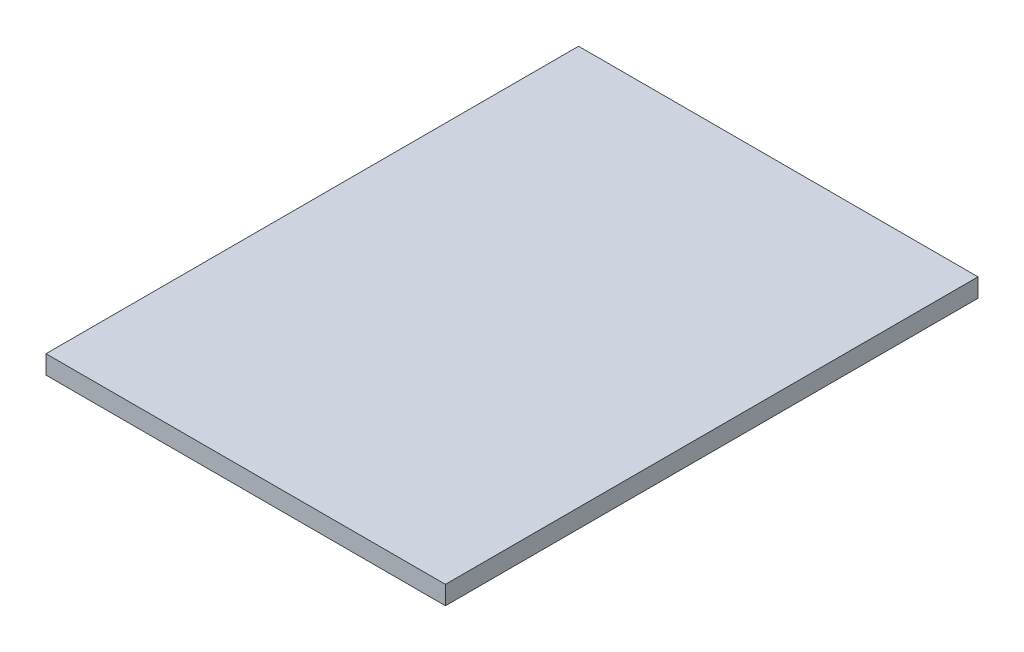
ISO-10303-21;
HEADER;
FILE_DESCRIPTION(('STEP AP214'),'2;1');
FILE_NAME('part.step','',(''),(''),'','','');
FILE_SCHEMA(('AUTOMOTIVE_DESIGN { 1 0 10303 214 1 1 1 1 }'));
ENDSEC;
DATA;
#1=APPLICATION_CONTEXT('core data for automotive mechanical design processes');
#2=APPLICATION_PROTOCOL_DEFINITION('international standard','automotive_design',2000,#1);
#3=PRODUCT_CONTEXT('',#1,'mechanical');
#4=PRODUCT('Part','Part','',(#3));
#5=PRODUCT_RELATED_PRODUCT_CATEGORY('part','',(#4));
#6=PRODUCT_DEFINITION_FORMATION('','',#4);
#7=PRODUCT_DEFINITION_CONTEXT('part definition',#1,'design');
#8=PRODUCT_DEFINITION('design','',#6,#7);
#9=PRODUCT_DEFINITION_SHAPE('','',#8);
#10=(LENGTH_UNIT() NAMED_UNIT(*) SI_UNIT(.MILLI.,.METRE.));
#11=(NAMED_UNIT(*) PLANE_ANGLE_UNIT() SI_UNIT($,.RADIAN.));
#12=(NAMED_UNIT(*) SI_UNIT($,.STERADIAN.) SOLID_ANGLE_UNIT());
#13=UNCERTAINTY_MEASURE_WITH_UNIT(LENGTH_MEASURE(1.E-05),#10,'distance_accuracy_value','');
#14=(GEOMETRIC_REPRESENTATION_CONTEXT(3) GLOBAL_UNCERTAINTY_ASSIGNED_CONTEXT((#13)) GLOBAL_UNIT_ASSIGNED_CONTEXT((#10,
#11,#12)) REPRESENTATION_CONTEXT('',''));
#15=CARTESIAN_POINT('',(0.,0.,0.));
#16=DIRECTION('',(0.,0.,1.));
#17=DIRECTION('',(1.,0.,0.));
#18=AXIS2_PLACEMENT_3D('',#15,#16,#17);
#19=CARTESIAN_POINT('',(32.25,3.,-43.));
#20=DIRECTION('',(-1.,0.,0.));
#21=DIRECTION('',(0.,0.,1.));
#22=AXIS2_PLACEMENT_3D('',#19,#20,#21);
#23=PLANE('',#22);
#24=DIRECTION('',(0.,0.,-1.));
#25=VECTOR('',#24,1.);
#26=CARTESIAN_POINT('',(32.25,0.,-43.));
#27=LINE('',#26,#25);
#28=CARTESIAN_POINT('',(32.25,0.,43.));
#29=VERTEX_POINT('',#28);
#30=CARTESIAN_POINT('',(32.25,0.,-43.));
#31=VERTEX_POINT('',#30);
#32=EDGE_CURVE('E113',#29,#31,#27,.T.);
#33=ORIENTED_EDGE('',*,*,#32,.T.);
#34=DIRECTION('',(0.,-1.,0.));
#35=VECTOR('',#34,1.);
#36=CARTESIAN_POINT('',(32.25,3.,-43.));
#37=LINE('',#36,#35);
#38=CARTESIAN_POINT('',(32.25,3.,-43.));
#39=VERTEX_POINT('',#38);
#40=EDGE_CURVE('E11',#39,#31,#37,.T.);
#41=ORIENTED_EDGE('',*,*,#40,.F.);
#42=DIRECTION('',(0.,0.,-1.));
#43=VECTOR('',#42,1.);
#44=CARTESIAN_POINT('',(32.25,3.,-43.));
#45=LINE('',#44,#43);
#46=CARTESIAN_POINT('',(32.25,3.,43.));
#47=VERTEX_POINT('',#46);
#48=EDGE_CURVE('E97',#47,#39,#45,.T.);
#49=ORIENTED_EDGE('',*,*,#48,.F.);
#50=DIRECTION('',(0.,-1.,0.));
#51=VECTOR('',#50,1.);
#52=CARTESIAN_POINT('',(32.25,3.,43.));
#53=LINE('',#52,#51);
#54=EDGE_CURVE('E109',#47,#29,#53,.T.);
#55=ORIENTED_EDGE('',*,*,#54,.T.);
#56=EDGE_LOOP('',(#33,#41,#49,#55));
#57=FACE_BOUND('',#56,.T.);
#58=ADVANCED_FACE('F45',(#57),#23,.F.);
#59=CARTESIAN_POINT('',(-32.25,3.,-43.));
#60=DIRECTION('',(0.,0.,1.));
#61=DIRECTION('',(1.,0.,0.));
#62=AXIS2_PLACEMENT_3D('',#59,#60,#61);
#63=PLANE('',#62);
#64=DIRECTION('',(-1.,0.,0.));
#65=VECTOR('',#64,1.);
#66=CARTESIAN_POINT('',(-32.25,0.,-43.));
#67=LINE('',#66,#65);
#68=CARTESIAN_POINT('',(-32.25,0.,-43.));
#69=VERTEX_POINT('',#68);
#70=EDGE_CURVE('E102',#31,#69,#67,.T.);
#71=ORIENTED_EDGE('',*,*,#70,.T.);
#72=DIRECTION('',(0.,-1.,0.));
#73=VECTOR('',#72,1.);
#74=CARTESIAN_POINT('',(-32.25,3.,-43.));
#75=LINE('',#74,#73);
#76=CARTESIAN_POINT('',(-32.25,3.,-43.));
#77=VERTEX_POINT('',#76);
#78=EDGE_CURVE('E54',#77,#69,#75,.T.);
#79=ORIENTED_EDGE('',*,*,#78,.F.);
#80=DIRECTION('',(-1.,0.,0.));
#81=VECTOR('',#80,1.);
#82=CARTESIAN_POINT('',(-32.25,3.,-43.));
#83=LINE('',#82,#81);
#84=EDGE_CURVE('E92',#39,#77,#83,.T.);
#85=ORIENTED_EDGE('',*,*,#84,.F.);
#86=ORIENTED_EDGE('',*,*,#40,.T.);
#87=EDGE_LOOP('',(#71,#79,#85,#86));
#88=FACE_BOUND('',#87,.T.);
#89=ADVANCED_FACE('F101',(#88),#63,.F.);
#90=CARTESIAN_POINT('',(-32.25,3.,-43.));
#91=DIRECTION('',(1.,0.,0.));
#92=DIRECTION('',(0.,0.,-1.));
#93=AXIS2_PLACEMENT_3D('',#90,#91,#92);
#94=PLANE('',#93);
#95=DIRECTION('',(0.,0.,1.));
#96=VECTOR('',#95,1.);
#97=CARTESIAN_POINT('',(-32.25,0.,-43.));
#98=LINE('',#97,#96);
#99=CARTESIAN_POINT('',(-32.25,0.,43.));
#100=VERTEX_POINT('',#99);
#101=EDGE_CURVE('E79',#69,#100,#98,.T.);
#102=ORIENTED_EDGE('',*,*,#101,.T.);
#103=DIRECTION('',(0.,-1.,0.));
#104=VECTOR('',#103,1.);
#105=CARTESIAN_POINT('',(-32.25,3.,43.));
#106=LINE('',#105,#104);
#107=CARTESIAN_POINT('',(-32.25,3.,43.));
#108=VERTEX_POINT('',#107);
#109=EDGE_CURVE('E104',#108,#100,#106,.T.);
#110=ORIENTED_EDGE('',*,*,#109,.F.);
#111=DIRECTION('',(0.,0.,1.));
#112=VECTOR('',#111,1.);
#113=CARTESIAN_POINT('',(-32.25,3.,-43.));
#114=LINE('',#113,#112);
#115=EDGE_CURVE('E95',#77,#108,#114,.T.);
#116=ORIENTED_EDGE('',*,*,#115,.F.);
#117=ORIENTED_EDGE('',*,*,#78,.T.);
#118=EDGE_LOOP('',(#102,#110,#116,#117));
#119=FACE_BOUND('',#118,.T.);
#120=ADVANCED_FACE('F105',(#119),#94,.F.);
#121=CARTESIAN_POINT('',(-32.25,3.,43.));
#122=DIRECTION('',(0.,0.,-1.));
#123=DIRECTION('',(-1.,0.,0.));
#124=AXIS2_PLACEMENT_3D('',#121,#122,#123);
#125=PLANE('',#124);
#126=DIRECTION('',(1.,0.,0.));
#127=VECTOR('',#126,1.);
#128=CARTESIAN_POINT('',(-32.25,0.,43.));
#129=LINE('',#128,#127);
#130=EDGE_CURVE('E85',#100,#29,#129,.T.);
#131=ORIENTED_EDGE('',*,*,#130,.T.);
#132=ORIENTED_EDGE('',*,*,#54,.F.);
#133=DIRECTION('',(1.,0.,0.));
#134=VECTOR('',#133,1.);
#135=CARTESIAN_POINT('',(-32.25,3.,43.));
#136=LINE('',#135,#134);
#137=EDGE_CURVE('E62',#108,#47,#136,.T.);
#138=ORIENTED_EDGE('',*,*,#137,.F.);
#139=ORIENTED_EDGE('',*,*,#109,.T.);
#140=EDGE_LOOP('',(#131,#132,#138,#139));
#141=FACE_BOUND('',#140,.T.);
#142=ADVANCED_FACE('F126',(#141),#125,.F.);
#143=CARTESIAN_POINT('',(0.,3.,0.));
#144=DIRECTION('',(0.,1.,0.));
#145=DIRECTION('',(0.,0.,1.));
#146=AXIS2_PLACEMENT_3D('',#143,#144,#145);
#147=PLANE('',#146);
#148=ORIENTED_EDGE('',*,*,#48,.T.);
#149=ORIENTED_EDGE('',*,*,#84,.T.);
#150=ORIENTED_EDGE('',*,*,#115,.T.);
#151=ORIENTED_EDGE('',*,*,#137,.T.);
#152=EDGE_LOOP('',(#148,#149,#150,#151));
#153=FACE_BOUND('',#152,.T.);
#154=ADVANCED_FACE('F93',(#153),#147,.T.);
#155=CARTESIAN_POINT('',(0.,0.,0.));
#156=DIRECTION('',(0.,1.,0.));
#157=DIRECTION('',(0.,0.,1.));
#158=AXIS2_PLACEMENT_3D('',#155,#156,#157);
#159=PLANE('',#158);
#160=ORIENTED_EDGE('',*,*,#32,.F.);
#161=ORIENTED_EDGE('',*,*,#130,.F.);
#162=ORIENTED_EDGE('',*,*,#101,.F.);
#163=ORIENTED_EDGE('',*,*,#70,.F.);
#164=EDGE_LOOP('',(#160,#161,#162,#163));
#165=FACE_BOUND('',#164,.T.);
#166=ADVANCED_FACE('F129',(#165),#159,.F.);
#167=CLOSED_SHELL('',(#58,#89,#120,#142,#154,#166));
#168=MANIFOLD_SOLID_BREP('B2',#167);
#169=ADVANCED_BREP_SHAPE_REPRESENTATION('',(#18,#168),#14);
#170=SHAPE_DEFINITION_REPRESENTATION(#9,#169);
ENDSEC;
END-ISO-10303-21;
